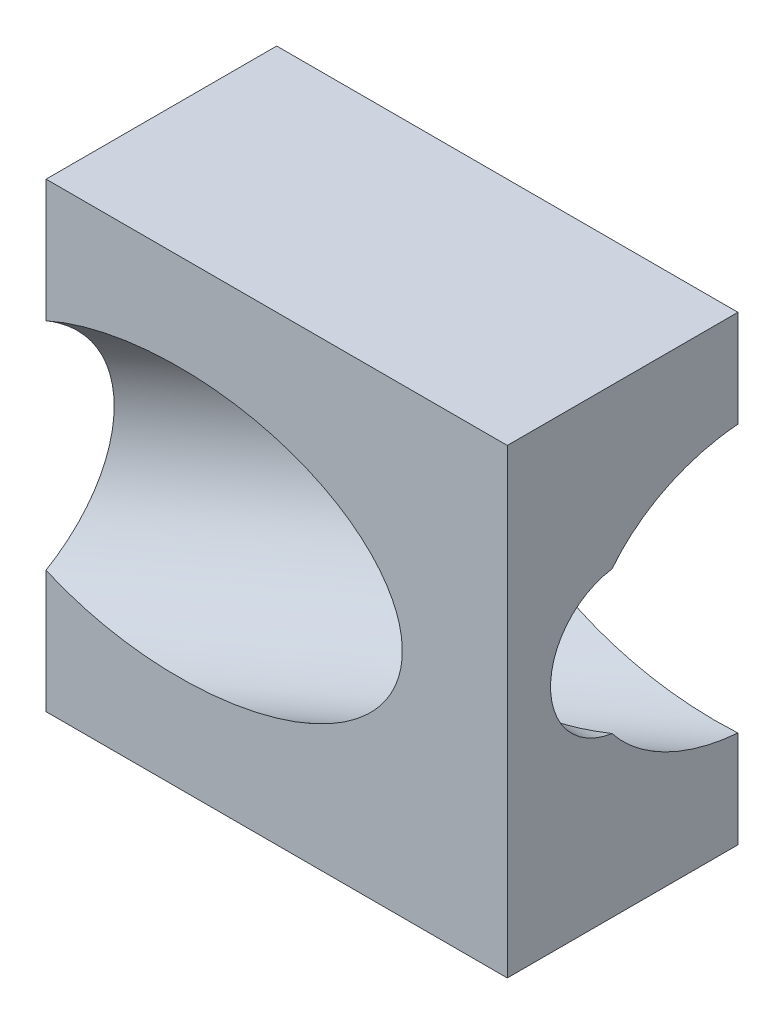
ISO-10303-21;
HEADER;
FILE_DESCRIPTION(('STEP AP214'),'2;1');
FILE_NAME('part.step','',(''),(''),'','','');
FILE_SCHEMA(('AUTOMOTIVE_DESIGN { 1 0 10303 214 1 1 1 1 }'));
ENDSEC;
DATA;
#1=APPLICATION_CONTEXT('core data for automotive mechanical design processes');
#2=APPLICATION_PROTOCOL_DEFINITION('international standard','automotive_design',2000,#1);
#3=PRODUCT_CONTEXT('',#1,'mechanical');
#4=PRODUCT('Part','Part','',(#3));
#5=PRODUCT_RELATED_PRODUCT_CATEGORY('part','',(#4));
#6=PRODUCT_DEFINITION_FORMATION('','',#4);
#7=PRODUCT_DEFINITION_CONTEXT('part definition',#1,'design');
#8=PRODUCT_DEFINITION('design','',#6,#7);
#9=PRODUCT_DEFINITION_SHAPE('','',#8);
#10=(LENGTH_UNIT() NAMED_UNIT(*) SI_UNIT(.MILLI.,.METRE.));
#11=(NAMED_UNIT(*) PLANE_ANGLE_UNIT() SI_UNIT($,.RADIAN.));
#12=(NAMED_UNIT(*) SI_UNIT($,.STERADIAN.) SOLID_ANGLE_UNIT());
#13=UNCERTAINTY_MEASURE_WITH_UNIT(LENGTH_MEASURE(1.E-05),#10,'distance_accuracy_value','');
#14=(GEOMETRIC_REPRESENTATION_CONTEXT(3) GLOBAL_UNCERTAINTY_ASSIGNED_CONTEXT((#13)) GLOBAL_UNIT_ASSIGNED_CONTEXT((#10,
#11,#12)) REPRESENTATION_CONTEXT('',''));
#15=CARTESIAN_POINT('',(0.,0.,0.));
#16=DIRECTION('',(0.,0.,1.));
#17=DIRECTION('',(1.,0.,0.));
#18=AXIS2_PLACEMENT_3D('',#15,#16,#17);
#19=CARTESIAN_POINT('',(0.,0.,25.4));
#20=DIRECTION('',(1.,0.,0.));
#21=DIRECTION('',(0.,0.,-1.));
#22=AXIS2_PLACEMENT_3D('',#19,#20,#21);
#23=PLANE('',#22);
#24=DIRECTION('',(0.,-1.,0.));
#25=VECTOR('',#24,1.);
#26=CARTESIAN_POINT('',(0.,0.,25.4));
#27=LINE('',#26,#25);
#28=CARTESIAN_POINT('',(0.,13.507390540863,25.4));
#29=VERTEX_POINT('',#28);
#30=CARTESIAN_POINT('',(0.,0.,25.4));
#31=VERTEX_POINT('',#30);
#32=EDGE_CURVE('E124',#29,#31,#27,.T.);
#33=ORIENTED_EDGE('',*,*,#32,.F.);
#34=CARTESIAN_POINT('',(0.,25.4,36.4341203264367));
#35=DIRECTION('',(1.,0.,0.));
#36=DIRECTION('',(0.,0.,1.));
#37=AXIS2_PLACEMENT_3D('',#34,#35,#36);
#38=ELLIPSE('',#37,18.5337116793206,14.8016802800836);
#39=CARTESIAN_POINT('',(0.,37.292609459137,25.4));
#40=VERTEX_POINT('',#39);
#41=EDGE_CURVE('E51',#29,#40,#38,.T.);
#42=ORIENTED_EDGE('',*,*,#41,.T.);
#43=CARTESIAN_POINT('',(0.,50.8,25.4));
#44=VERTEX_POINT('',#43);
#45=EDGE_CURVE('E151',#44,#40,#27,.T.);
#46=ORIENTED_EDGE('',*,*,#45,.F.);
#47=DIRECTION('',(0.,0.,-1.));
#48=VECTOR('',#47,1.);
#49=CARTESIAN_POINT('',(0.,50.8,25.4));
#50=LINE('',#49,#48);
#51=CARTESIAN_POINT('',(0.,50.8,0.));
#52=VERTEX_POINT('',#51);
#53=EDGE_CURVE('E125',#44,#52,#50,.T.);
#54=ORIENTED_EDGE('',*,*,#53,.T.);
#55=DIRECTION('',(0.,-1.,0.));
#56=VECTOR('',#55,1.);
#57=CARTESIAN_POINT('',(0.,0.,0.));
#58=LINE('',#57,#56);
#59=CARTESIAN_POINT('',(0.,0.,0.));
#60=VERTEX_POINT('',#59);
#61=EDGE_CURVE('E119',#52,#60,#58,.T.);
#62=ORIENTED_EDGE('',*,*,#61,.T.);
#63=DIRECTION('',(0.,0.,-1.));
#64=VECTOR('',#63,1.);
#65=CARTESIAN_POINT('',(0.,0.,25.4));
#66=LINE('',#65,#64);
#67=EDGE_CURVE('E45',#31,#60,#66,.T.);
#68=ORIENTED_EDGE('',*,*,#67,.F.);
#69=EDGE_LOOP('',(#33,#42,#46,#54,#62,#68));
#70=FACE_BOUND('',#69,.T.);
#71=ADVANCED_FACE('F33',(#70),#23,.F.);
#72=CARTESIAN_POINT('',(0.,0.,25.4));
#73=DIRECTION('',(0.,1.,0.));
#74=DIRECTION('',(0.,0.,1.));
#75=AXIS2_PLACEMENT_3D('',#72,#73,#74);
#76=PLANE('',#75);
#77=DIRECTION('',(1.,0.,0.));
#78=VECTOR('',#77,1.);
#79=CARTESIAN_POINT('',(0.,0.,0.));
#80=LINE('',#79,#78);
#81=CARTESIAN_POINT('',(50.8,0.,0.));
#82=VERTEX_POINT('',#81);
#83=EDGE_CURVE('E117',#60,#82,#80,.T.);
#84=ORIENTED_EDGE('',*,*,#83,.T.);
#85=DIRECTION('',(0.,0.,-1.));
#86=VECTOR('',#85,1.);
#87=CARTESIAN_POINT('',(50.8,0.,25.4));
#88=LINE('',#87,#86);
#89=CARTESIAN_POINT('',(50.8,0.,25.4));
#90=VERTEX_POINT('',#89);
#91=EDGE_CURVE('E131',#90,#82,#88,.T.);
#92=ORIENTED_EDGE('',*,*,#91,.F.);
#93=DIRECTION('',(1.,0.,0.));
#94=VECTOR('',#93,1.);
#95=CARTESIAN_POINT('',(0.,0.,25.4));
#96=LINE('',#95,#94);
#97=EDGE_CURVE('E140',#31,#90,#96,.T.);
#98=ORIENTED_EDGE('',*,*,#97,.F.);
#99=ORIENTED_EDGE('',*,*,#67,.T.);
#100=EDGE_LOOP('',(#84,#92,#98,#99));
#101=FACE_BOUND('',#100,.T.);
#102=ADVANCED_FACE('F138',(#101),#76,.F.);
#103=CARTESIAN_POINT('',(50.8,0.,25.4));
#104=DIRECTION('',(-1.,0.,0.));
#105=DIRECTION('',(0.,0.,1.));
#106=AXIS2_PLACEMENT_3D('',#103,#104,#105);
#107=PLANE('',#106);
#108=CARTESIAN_POINT('',(50.8,25.4,12.7));
#109=DIRECTION('',(1.,0.,0.));
#110=DIRECTION('',(0.,0.,-1.));
#111=AXIS2_PLACEMENT_3D('',#108,#109,#110);
#112=CIRCLE('',#111,7.9375);
#113=CARTESIAN_POINT('',(50.8,33.2515549161921,13.8648998446302));
#114=VERTEX_POINT('',#113);
#115=CARTESIAN_POINT('',(50.8,17.5484450838079,13.8648998446302));
#116=VERTEX_POINT('',#115);
#117=EDGE_CURVE('E110',#114,#116,#112,.T.);
#118=ORIENTED_EDGE('',*,*,#117,.F.);
#119=CARTESIAN_POINT('',(50.8,25.4,-1.84642541878623));
#120=DIRECTION('',(-1.,0.,0.));
#121=DIRECTION('',(0.,0.,1.));
#122=AXIS2_PLACEMENT_3D('',#119,#120,#121);
#123=ELLIPSE('',#122,18.5337116793206,14.8016802800836);
#124=CARTESIAN_POINT('',(50.8,40.128042378304,0.));
#125=VERTEX_POINT('',#124);
#126=EDGE_CURVE('E59',#114,#125,#123,.T.);
#127=ORIENTED_EDGE('',*,*,#126,.T.);
#128=DIRECTION('',(0.,1.,0.));
#129=VECTOR('',#128,1.);
#130=CARTESIAN_POINT('',(50.8,0.,0.));
#131=LINE('',#130,#129);
#132=CARTESIAN_POINT('',(50.8,50.8,0.));
#133=VERTEX_POINT('',#132);
#134=EDGE_CURVE('E107',#125,#133,#131,.T.);
#135=ORIENTED_EDGE('',*,*,#134,.T.);
#136=DIRECTION('',(0.,0.,-1.));
#137=VECTOR('',#136,1.);
#138=CARTESIAN_POINT('',(50.8,50.8,25.4));
#139=LINE('',#138,#137);
#140=CARTESIAN_POINT('',(50.8,50.8,25.4));
#141=VERTEX_POINT('',#140);
#142=EDGE_CURVE('E128',#141,#133,#139,.T.);
#143=ORIENTED_EDGE('',*,*,#142,.F.);
#144=DIRECTION('',(0.,1.,0.));
#145=VECTOR('',#144,1.);
#146=CARTESIAN_POINT('',(50.8,0.,25.4));
#147=LINE('',#146,#145);
#148=EDGE_CURVE('E148',#90,#141,#147,.T.);
#149=ORIENTED_EDGE('',*,*,#148,.F.);
#150=ORIENTED_EDGE('',*,*,#91,.T.);
#151=CARTESIAN_POINT('',(50.8,10.671957621696,0.));
#152=VERTEX_POINT('',#151);
#153=EDGE_CURVE('E116',#82,#152,#131,.T.);
#154=ORIENTED_EDGE('',*,*,#153,.T.);
#155=EDGE_CURVE('E96',#152,#116,#123,.T.);
#156=ORIENTED_EDGE('',*,*,#155,.T.);
#157=EDGE_LOOP('',(#118,#127,#135,#143,#149,#150,#154,#156));
#158=FACE_BOUND('',#157,.T.);
#159=ADVANCED_FACE('F105',(#158),#107,.F.);
#160=CARTESIAN_POINT('',(0.,50.8,25.4));
#161=DIRECTION('',(0.,-1.,0.));
#162=DIRECTION('',(0.,0.,-1.));
#163=AXIS2_PLACEMENT_3D('',#160,#161,#162);
#164=PLANE('',#163);
#165=DIRECTION('',(-1.,0.,0.));
#166=VECTOR('',#165,1.);
#167=CARTESIAN_POINT('',(0.,50.8,0.));
#168=LINE('',#167,#166);
#169=EDGE_CURVE('E115',#133,#52,#168,.T.);
#170=ORIENTED_EDGE('',*,*,#169,.T.);
#171=ORIENTED_EDGE('',*,*,#53,.F.);
#172=DIRECTION('',(-1.,0.,0.));
#173=VECTOR('',#172,1.);
#174=CARTESIAN_POINT('',(0.,50.8,25.4));
#175=LINE('',#174,#173);
#176=EDGE_CURVE('E129',#141,#44,#175,.T.);
#177=ORIENTED_EDGE('',*,*,#176,.F.);
#178=ORIENTED_EDGE('',*,*,#142,.T.);
#179=EDGE_LOOP('',(#170,#171,#177,#178));
#180=FACE_BOUND('',#179,.T.);
#181=ADVANCED_FACE('F176',(#180),#164,.F.);
#182=CARTESIAN_POINT('',(0.,0.,25.4));
#183=DIRECTION('',(0.,0.,-1.));
#184=DIRECTION('',(-1.,0.,0.));
#185=AXIS2_PLACEMENT_3D('',#182,#183,#184);
#186=PLANE('',#185);
#187=ORIENTED_EDGE('',*,*,#45,.T.);
#188=CARTESIAN_POINT('',(14.6427722403339,25.4,25.4));
#189=DIRECTION('',(0.,0.,-1.));
#190=DIRECTION('',(-1.,0.,0.));
#191=AXIS2_PLACEMENT_3D('',#188,#189,#190);
#192=ELLIPSE('',#191,24.5950661094475,14.8016802800836);
#193=EDGE_CURVE('E101',#40,#29,#192,.T.);
#194=ORIENTED_EDGE('',*,*,#193,.T.);
#195=ORIENTED_EDGE('',*,*,#32,.T.);
#196=ORIENTED_EDGE('',*,*,#97,.T.);
#197=ORIENTED_EDGE('',*,*,#148,.T.);
#198=ORIENTED_EDGE('',*,*,#176,.T.);
#199=EDGE_LOOP('',(#187,#194,#195,#196,#197,#198));
#200=FACE_BOUND('',#199,.T.);
#201=ADVANCED_FACE('F163',(#200),#186,.F.);
#202=CARTESIAN_POINT('',(0.,0.,0.));
#203=DIRECTION('',(0.,0.,-1.));
#204=DIRECTION('',(-1.,0.,0.));
#205=AXIS2_PLACEMENT_3D('',#202,#203,#204);
#206=PLANE('',#205);
#207=CARTESIAN_POINT('',(48.3497107094915,25.4,0.));
#208=DIRECTION('',(0.,0.,-1.));
#209=DIRECTION('',(-1.,0.,0.));
#210=AXIS2_PLACEMENT_3D('',#207,#208,#209);
#211=ELLIPSE('',#210,24.5950661094475,14.8016802800836);
#212=EDGE_CURVE('E93',#152,#125,#211,.T.);
#213=ORIENTED_EDGE('',*,*,#212,.F.);
#214=ORIENTED_EDGE('',*,*,#153,.F.);
#215=ORIENTED_EDGE('',*,*,#83,.F.);
#216=ORIENTED_EDGE('',*,*,#61,.F.);
#217=ORIENTED_EDGE('',*,*,#169,.F.);
#218=ORIENTED_EDGE('',*,*,#134,.F.);
#219=EDGE_LOOP('',(#213,#214,#215,#216,#217,#218));
#220=FACE_BOUND('',#219,.T.);
#221=ADVANCED_FACE('F113',(#220),#206,.T.);
#222=CARTESIAN_POINT('',(25.4,25.4,12.7));
#223=DIRECTION('',(1.,0.,0.));
#224=DIRECTION('',(0.,0.,-1.));
#225=AXIS2_PLACEMENT_3D('',#222,#223,#224);
#226=CYLINDRICAL_SURFACE('',#225,7.9375);
#227=ORIENTED_EDGE('',*,*,#117,.T.);
#228=CARTESIAN_POINT('',(50.8,17.5484450838079,13.8648998446302));
#229=CARTESIAN_POINT('',(50.6731988577936,17.5644920197787,13.9730191926235));
#230=CARTESIAN_POINT('',(50.5475506325277,17.5829556098784,14.0821207384395));
#231=CARTESIAN_POINT('',(50.2987918330882,17.6250889440316,14.3022636841595));
#232=CARTESIAN_POINT('',(50.1756819918522,17.6487601693461,14.4133056277014));
#233=CARTESIAN_POINT('',(49.8098596034559,17.7282935943804,14.7499074423885));
#234=CARTESIAN_POINT('',(49.5714454189309,17.7925805169705,14.978270870686));
#235=CARTESIAN_POINT('',(49.1069310642642,17.9474160742832,15.4428770830844));
#236=CARTESIAN_POINT('',(48.8809551805917,18.0381869579003,15.6791709205145));
#237=CARTESIAN_POINT('',(48.4469463029272,18.24903699394,16.1547203438335));
#238=CARTESIAN_POINT('',(48.2388870539472,18.3690722382314,16.3939709874992));
#239=CARTESIAN_POINT('',(47.9117030312293,18.5944045116693,16.7890359640337));
#240=CARTESIAN_POINT('',(47.7866333161304,18.6905324665292,16.9451990891276));
#241=CARTESIAN_POINT('',(47.5461599505916,18.8972123635251,17.2554791985824));
#242=CARTESIAN_POINT('',(47.4307564951237,19.0077645964893,17.4095961416183));
#243=CARTESIAN_POINT('',(47.2107313816485,19.2431030683623,17.7133099720986));
#244=CARTESIAN_POINT('',(47.1060674452087,19.3678290694589,17.8629228053672));
#245=CARTESIAN_POINT('',(46.9074168374278,19.6318417385586,18.1562982566631));
#246=CARTESIAN_POINT('',(46.8134299683882,19.771128136867,18.3000609829804));
#247=CARTESIAN_POINT('',(46.6357849799278,20.0647810978332,18.5805461533895));
#248=CARTESIAN_POINT('',(46.5521951034987,20.2192364902907,18.7172189669687));
#249=CARTESIAN_POINT('',(46.3960041088504,20.5417254402718,18.9804775507011));
#250=CARTESIAN_POINT('',(46.3234033097661,20.7097593919144,19.1070630278565));
#251=CARTESIAN_POINT('',(46.1888723531686,21.0585214379958,19.3483448133966));
#252=CARTESIAN_POINT('',(46.1269553876023,21.239264843583,19.4630263547004));
#253=CARTESIAN_POINT('',(46.0135064024949,21.6118977905584,19.6785750633236));
#254=CARTESIAN_POINT('',(45.9619737922785,21.8037866971761,19.779443016273));
#255=CARTESIAN_POINT('',(45.8722922883714,22.1824269770165,19.9589043058505));
#256=CARTESIAN_POINT('',(45.8334306150104,22.3684889921508,20.0385994294858));
#257=CARTESIAN_POINT('',(45.7637756080302,22.7474792691639,20.1839309953138));
#258=CARTESIAN_POINT('',(45.7329818402784,22.9404071609564,20.2495681939262));
#259=CARTESIAN_POINT('',(45.6790945845302,23.3316645203236,20.3659991680725));
#260=CARTESIAN_POINT('',(45.6559984851578,23.5299921313364,20.416797976694));
#261=CARTESIAN_POINT('',(45.6171748019354,23.9306734841852,20.5030110063008));
#262=CARTESIAN_POINT('',(45.6014472840246,24.1330272620333,20.5384250896125));
#263=CARTESIAN_POINT('',(45.5772516498194,24.5382210448531,20.5932005590064));
#264=CARTESIAN_POINT('',(45.568711391013,24.7410352147268,20.6127214079942));
#265=CARTESIAN_POINT('',(45.5584922798766,25.1477342915127,20.636104541812));
#266=CARTESIAN_POINT('',(45.5568133516931,25.3516191865627,20.6399669997487));
#267=CARTESIAN_POINT('',(45.5602907615176,25.7590339738482,20.631993169495));
#268=CARTESIAN_POINT('',(45.5654474546625,25.9625638470888,20.6201560656516));
#269=CARTESIAN_POINT('',(45.5826762837838,26.3678221648149,20.5809054067485));
#270=CARTESIAN_POINT('',(45.594748450512,26.5695506012857,20.5534917824229));
#271=CARTESIAN_POINT('',(45.6260449963369,26.9705006437809,20.483251635084));
#272=CARTESIAN_POINT('',(45.6452950732438,27.1697105511987,20.440369751991));
#273=CARTESIAN_POINT('',(45.6912144264871,27.5634484783733,20.3396785264801));
#274=CARTESIAN_POINT('',(45.717883703567,27.7579764976609,20.2818691825665));
#275=CARTESIAN_POINT('',(45.7789808310755,28.1409340215325,20.1519838339412));
#276=CARTESIAN_POINT('',(45.8134078691664,28.3293641622823,20.0799093230727));
#277=CARTESIAN_POINT('',(45.8904068306788,28.6988004796505,19.922336743646));
#278=CARTESIAN_POINT('',(45.9329786946597,28.8798067104368,19.8368387730524));
#279=CARTESIAN_POINT('',(46.0264729785191,29.2324290025144,19.6538260268316));
#280=CARTESIAN_POINT('',(46.0773616418743,29.4040794293913,19.5563602087825));
#281=CARTESIAN_POINT('',(46.1879583930521,29.7376194575114,19.3503671772387));
#282=CARTESIAN_POINT('',(46.2476663848935,29.8995091649542,19.2418400841285));
#283=CARTESIAN_POINT('',(46.3761537014344,30.2124977703721,19.0151483594888));
#284=CARTESIAN_POINT('',(46.4449302467204,30.3635999528224,18.8969866850719));
#285=CARTESIAN_POINT('',(46.5917184221007,30.6542832925051,18.6525189421208));
#286=CARTESIAN_POINT('',(46.6697301358315,30.7938643453792,18.5262127998326));
#287=CARTESIAN_POINT('',(46.8357496638605,31.0621886750842,18.2658598657051));
#288=CARTESIAN_POINT('',(46.9238432502003,31.1908197862737,18.1317522906753));
#289=CARTESIAN_POINT('',(47.109252441904,31.4354805549302,17.8585378489279));
#290=CARTESIAN_POINT('',(47.2065679311233,31.5515103710639,17.7194310451863));
#291=CARTESIAN_POINT('',(47.4101229409681,31.7709941305263,17.4377461089798));
#292=CARTESIAN_POINT('',(47.5163666294743,31.8744421446255,17.2951663775787));
#293=CARTESIAN_POINT('',(47.7372512020486,32.0689368270261,17.0080473241092));
#294=CARTESIAN_POINT('',(47.8518938862353,32.1599808248035,16.8635075874031));
#295=CARTESIAN_POINT('',(48.1366461990418,32.3642843481757,16.515510329848));
#296=CARTESIAN_POINT('',(48.3105269932097,32.4717616781725,16.3117257936938));
#297=CARTESIAN_POINT('',(48.6717512970584,32.664848746387,15.9056950242436));
#298=CARTESIAN_POINT('',(48.8591010416025,32.7504482726237,15.7034495519195));
#299=CARTESIAN_POINT('',(49.2454234342398,32.9018267664988,15.3024001792166));
#300=CARTESIAN_POINT('',(49.4444061593261,32.9675882365064,15.1035994619961));
#301=CARTESIAN_POINT('',(49.8519363568474,33.0812544117799,14.7109699265924));
#302=CARTESIAN_POINT('',(50.0604801380854,33.1291659441767,14.5171392339735));
#303=CARTESIAN_POINT('',(50.3596746599909,33.1854521377403,14.2482160187513));
#304=CARTESIAN_POINT('',(50.4470322382559,33.200441525305,14.1707601103284));
#305=CARTESIAN_POINT('',(50.6227391886367,33.2278647486859,14.0170110542884));
#306=CARTESIAN_POINT('',(50.7110852451344,33.2403053768048,13.9407153313937));
#307=CARTESIAN_POINT('',(50.8,33.2515549161921,13.8648998446302));
#308=B_SPLINE_CURVE_WITH_KNOTS('',3,(#228,#229,#230,#231,#232,#233,#234,#235,#236,#237,#238,
#239,#240,#241,#242,#243,#244,#245,#246,#247,#248,#249,#250,#251,#252,#253,#254,#255,#256,#257,
#258,#259,#260,#261,#262,#263,#264,#265,#266,#267,#268,#269,#270,#271,#272,#273,#274,#275,#276,
#277,#278,#279,#280,#281,#282,#283,#284,#285,#286,#287,#288,#289,#290,#291,#292,#293,#294,#295,
#296,#297,#298,#299,#300,#301,#302,#303,#304,#305,#306,#307),.UNSPECIFIED.,.F.,.F.,(4,2,2,2,2,2,
2,2,2,2,2,2,2,2,2,2,2,2,2,2,2,2,2,2,2,2,2,2,2,2,2,2,2,2,2,2,2,2,2,4),(0.,0.502180344760676,
1.00450371493647,2.01227062145711,3.02875051203791,4.04371456610318,4.70901489303604,
5.37432863609586,6.03691371376016,6.69948652087807,7.36620138397381,8.03293560548427,
8.70048728099217,9.36800097458792,9.98558409224869,10.6031339710484,11.2204741369631,
11.8378198271716,12.4488923534231,13.0599581241207,13.6710556432898,14.2821558799167,
14.8954652719475,15.5087747254373,16.1220199873297,16.7352607739545,17.3460716640147,
17.9568759070706,18.5674933784936,19.1781163802744,19.7943864303355,20.4106487198598,
21.027200309594,21.6438844308078,22.5084727088652,23.3734638198735,24.2392156574924,
25.1046360270799,25.4577358910366,25.8098821590947),.UNSPECIFIED.);
#309=EDGE_CURVE('E11',#116,#114,#308,.T.);
#310=ORIENTED_EDGE('',*,*,#309,.T.);
#311=EDGE_LOOP('',(#227,#310));
#312=FACE_BOUND('',#311,.T.);
#313=ADVANCED_FACE('F156',(#312),#226,.F.);
#314=CARTESIAN_POINT('',(49.912550985257,25.4,-1.17768461946687));
#315=DIRECTION('',(-0.798635510047286,0.,0.601815023152058));
#316=DIRECTION('',(0.601815023152058,0.,0.798635510047286));
#317=AXIS2_PLACEMENT_3D('',#314,#315,#316);
#318=CYLINDRICAL_SURFACE('',#317,14.8016802800836);
#319=ORIENTED_EDGE('',*,*,#212,.T.);
#320=ORIENTED_EDGE('',*,*,#126,.F.);
#321=ORIENTED_EDGE('',*,*,#309,.F.);
#322=ORIENTED_EDGE('',*,*,#155,.F.);
#323=EDGE_LOOP('',(#319,#320,#321,#322));
#324=FACE_BOUND('',#323,.T.);
#325=ORIENTED_EDGE('',*,*,#193,.F.);
#326=ORIENTED_EDGE('',*,*,#41,.F.);
#327=EDGE_LOOP('',(#325,#326));
#328=FACE_BOUND('',#327,.T.);
#329=ADVANCED_FACE('F94',(#324,#328),#318,.F.);
#330=CLOSED_SHELL('',(#71,#102,#159,#181,#201,#221,#313,#329));
#331=MANIFOLD_SOLID_BREP('B2',#330);
#332=ADVANCED_BREP_SHAPE_REPRESENTATION('',(#18,#331),#14);
#333=SHAPE_DEFINITION_REPRESENTATION(#9,#332);
ENDSEC;
END-ISO-10303-21;
